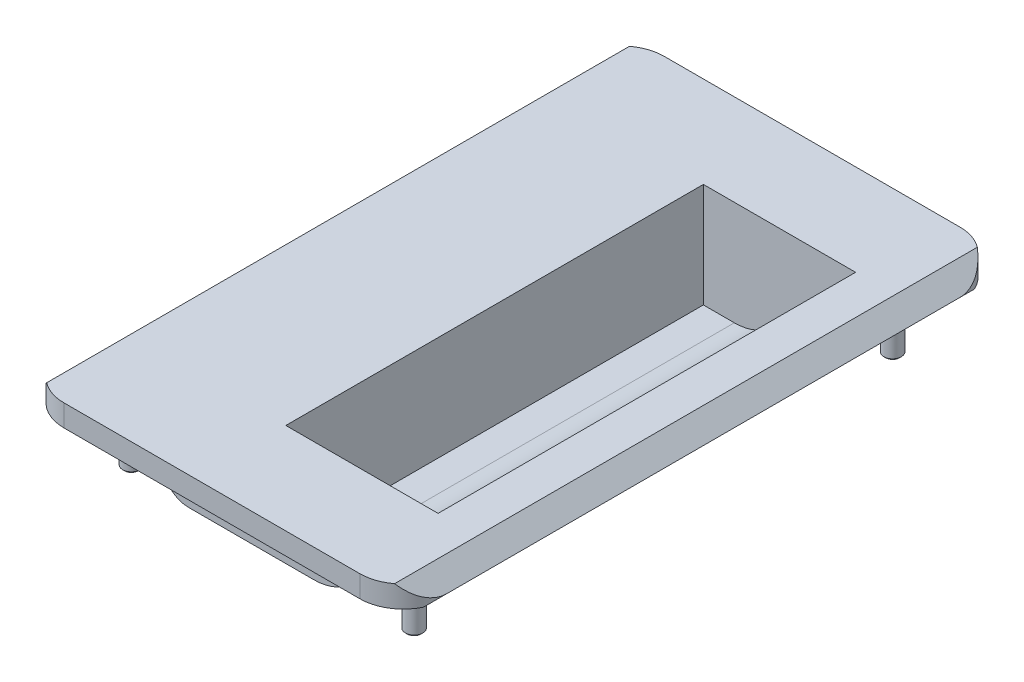
ISO-10303-21;
HEADER;
FILE_DESCRIPTION(('STEP AP214'),'2;1');
FILE_NAME('part.step','',(''),(''),'','','');
FILE_SCHEMA(('AUTOMOTIVE_DESIGN { 1 0 10303 214 1 1 1 1 }'));
ENDSEC;
DATA;
#1=APPLICATION_CONTEXT('core data for automotive mechanical design processes');
#2=APPLICATION_PROTOCOL_DEFINITION('international standard','automotive_design',2000,#1);
#3=PRODUCT_CONTEXT('',#1,'mechanical');
#4=PRODUCT('Part','Part','',(#3));
#5=PRODUCT_RELATED_PRODUCT_CATEGORY('part','',(#4));
#6=PRODUCT_DEFINITION_FORMATION('','',#4);
#7=PRODUCT_DEFINITION_CONTEXT('part definition',#1,'design');
#8=PRODUCT_DEFINITION('design','',#6,#7);
#9=PRODUCT_DEFINITION_SHAPE('','',#8);
#10=(LENGTH_UNIT() NAMED_UNIT(*) SI_UNIT(.MILLI.,.METRE.));
#11=(NAMED_UNIT(*) PLANE_ANGLE_UNIT() SI_UNIT($,.RADIAN.));
#12=(NAMED_UNIT(*) SI_UNIT($,.STERADIAN.) SOLID_ANGLE_UNIT());
#13=UNCERTAINTY_MEASURE_WITH_UNIT(LENGTH_MEASURE(1.E-05),#10,'distance_accuracy_value','');
#14=(GEOMETRIC_REPRESENTATION_CONTEXT(3) GLOBAL_UNCERTAINTY_ASSIGNED_CONTEXT((#13)) GLOBAL_UNIT_ASSIGNED_CONTEXT((#10,
#11,#12)) REPRESENTATION_CONTEXT('',''));
#15=CARTESIAN_POINT('',(0.,0.,0.));
#16=DIRECTION('',(0.,0.,1.));
#17=DIRECTION('',(1.,0.,0.));
#18=AXIS2_PLACEMENT_3D('',#15,#16,#17);
#19=CARTESIAN_POINT('',(34.0705,-14.,-55.));
#20=DIRECTION('',(0.,1.,0.));
#21=DIRECTION('',(0.,0.,1.));
#22=AXIS2_PLACEMENT_3D('',#19,#20,#21);
#23=PLANE('',#22);
#24=CARTESIAN_POINT('',(32.5,-14.00000000001,-55.));
#25=DIRECTION('',(0.,1.,0.));
#26=DIRECTION('',(0.,0.,1.));
#27=AXIS2_PLACEMENT_3D('',#24,#25,#26);
#28=CIRCLE('',#27,1.57050000000709);
#29=CARTESIAN_POINT('',(32.5,-14.00000000001,-53.4294999999929));
#30=VERTEX_POINT('',#29);
#31=EDGE_CURVE('E19',#30,#30,#28,.T.);
#32=ORIENTED_EDGE('',*,*,#31,.F.);
#33=EDGE_LOOP('',(#32));
#34=FACE_BOUND('',#33,.T.);
#35=ADVANCED_FACE('F16',(#34),#23,.F.);
#36=CARTESIAN_POINT('',(-30.9295,-14.,-55.));
#37=DIRECTION('',(0.,1.,0.));
#38=DIRECTION('',(0.,0.,1.));
#39=AXIS2_PLACEMENT_3D('',#36,#37,#38);
#40=PLANE('',#39);
#41=CARTESIAN_POINT('',(-32.5,-14.00000000001,-55.));
#42=DIRECTION('',(0.,1.,0.));
#43=DIRECTION('',(-1.,0.,0.));
#44=AXIS2_PLACEMENT_3D('',#41,#42,#43);
#45=CIRCLE('',#44,1.57050000004119);
#46=CARTESIAN_POINT('',(-34.0705000000412,-14.00000000001,-55.));
#47=VERTEX_POINT('',#46);
#48=EDGE_CURVE('E263',#47,#47,#45,.T.);
#49=ORIENTED_EDGE('',*,*,#48,.F.);
#50=EDGE_LOOP('',(#49));
#51=FACE_BOUND('',#50,.T.);
#52=ADVANCED_FACE('F274',(#51),#40,.F.);
#53=CARTESIAN_POINT('',(34.0705,-14.,55.));
#54=DIRECTION('',(0.,1.,0.));
#55=DIRECTION('',(0.,0.,1.));
#56=AXIS2_PLACEMENT_3D('',#53,#54,#55);
#57=PLANE('',#56);
#58=CARTESIAN_POINT('',(32.5,-14.0000000001237,55.));
#59=DIRECTION('',(0.,1.,0.));
#60=DIRECTION('',(0.,0.,1.));
#61=AXIS2_PLACEMENT_3D('',#58,#59,#60);
#62=CIRCLE('',#61,1.57049999996389);
#63=CARTESIAN_POINT('',(32.5,-14.0000000001237,56.5704999999639));
#64=VERTEX_POINT('',#63);
#65=EDGE_CURVE('E261',#64,#64,#62,.T.);
#66=ORIENTED_EDGE('',*,*,#65,.F.);
#67=EDGE_LOOP('',(#66));
#68=FACE_BOUND('',#67,.T.);
#69=ADVANCED_FACE('F279',(#68),#57,.F.);
#70=CARTESIAN_POINT('',(-30.9295,-14.,55.));
#71=DIRECTION('',(0.,1.,0.));
#72=DIRECTION('',(0.,0.,1.));
#73=AXIS2_PLACEMENT_3D('',#70,#71,#72);
#74=PLANE('',#73);
#75=CARTESIAN_POINT('',(-32.5,-14.0000000001237,55.));
#76=DIRECTION('',(0.,1.,0.));
#77=DIRECTION('',(0.,0.,1.));
#78=AXIS2_PLACEMENT_3D('',#75,#76,#77);
#79=CIRCLE('',#78,1.57049999996389);
#80=CARTESIAN_POINT('',(-32.5,-14.0000000001237,56.5704999999639));
#81=VERTEX_POINT('',#80);
#82=EDGE_CURVE('E257',#81,#81,#79,.T.);
#83=ORIENTED_EDGE('',*,*,#82,.F.);
#84=EDGE_LOOP('',(#83));
#85=FACE_BOUND('',#84,.T.);
#86=ADVANCED_FACE('F409',(#85),#74,.F.);
#87=CARTESIAN_POINT('',(32.5,-13.5705000001281,-55.));
#88=DIRECTION('',(0.,1.,0.));
#89=DIRECTION('',(0.,0.,1.));
#90=AXIS2_PLACEMENT_3D('',#87,#88,#89);
#91=CONICAL_SURFACE('',#90,1.99999999988904,0.78539816339745);
#92=ORIENTED_EDGE('',*,*,#31,.T.);
#93=EDGE_LOOP('',(#92));
#94=FACE_BOUND('',#93,.T.);
#95=CARTESIAN_POINT('',(32.5,-13.5705,-55.));
#96=DIRECTION('',(0.,1.,0.));
#97=DIRECTION('',(0.,0.,1.));
#98=AXIS2_PLACEMENT_3D('',#95,#96,#97);
#99=CIRCLE('',#98,2.);
#100=CARTESIAN_POINT('',(32.5,-13.5705,-53.));
#101=VERTEX_POINT('',#100);
#102=EDGE_CURVE('E427',#101,#101,#99,.T.);
#103=ORIENTED_EDGE('',*,*,#102,.F.);
#104=EDGE_LOOP('',(#103));
#105=FACE_BOUND('',#104,.T.);
#106=ADVANCED_FACE('F270',(#94,#105),#91,.T.);
#107=CARTESIAN_POINT('',(-32.5,-13.5705000000712,-55.));
#108=DIRECTION('',(0.,1.,0.));
#109=DIRECTION('',(-1.,0.,0.));
#110=AXIS2_PLACEMENT_3D('',#107,#108,#109);
#111=CONICAL_SURFACE('',#110,1.99999999997999,0.785398163397448);
#112=CARTESIAN_POINT('',(-32.5,-13.5705,-55.));
#113=DIRECTION('',(0.,1.,0.));
#114=DIRECTION('',(0.,0.,1.));
#115=AXIS2_PLACEMENT_3D('',#112,#113,#114);
#116=CIRCLE('',#115,2.);
#117=CARTESIAN_POINT('',(-32.5,-13.5705,-53.));
#118=VERTEX_POINT('',#117);
#119=EDGE_CURVE('E422',#118,#118,#116,.T.);
#120=ORIENTED_EDGE('',*,*,#119,.F.);
#121=EDGE_LOOP('',(#120));
#122=FACE_BOUND('',#121,.T.);
#123=ORIENTED_EDGE('',*,*,#48,.T.);
#124=EDGE_LOOP('',(#123));
#125=FACE_BOUND('',#124,.T.);
#126=ADVANCED_FACE('F402',(#122,#125),#111,.T.);
#127=CARTESIAN_POINT('',(32.5,-13.570500000128,55.));
#128=DIRECTION('',(0.,1.,0.));
#129=DIRECTION('',(0.,0.,1.));
#130=AXIS2_PLACEMENT_3D('',#127,#128,#129);
#131=CONICAL_SURFACE('',#130,2.00000000001637,0.785398163463622);
#132=ORIENTED_EDGE('',*,*,#65,.T.);
#133=EDGE_LOOP('',(#132));
#134=FACE_BOUND('',#133,.T.);
#135=CARTESIAN_POINT('',(32.5,-13.5705,55.));
#136=DIRECTION('',(0.,1.,0.));
#137=DIRECTION('',(0.,0.,1.));
#138=AXIS2_PLACEMENT_3D('',#135,#136,#137);
#139=CIRCLE('',#138,2.);
#140=CARTESIAN_POINT('',(32.5,-13.5705,57.));
#141=VERTEX_POINT('',#140);
#142=EDGE_CURVE('E421',#141,#141,#139,.T.);
#143=ORIENTED_EDGE('',*,*,#142,.F.);
#144=EDGE_LOOP('',(#143));
#145=FACE_BOUND('',#144,.T.);
#146=ADVANCED_FACE('F398',(#134,#145),#131,.T.);
#147=CARTESIAN_POINT('',(-32.5,-13.5705000000712,55.));
#148=DIRECTION('',(0.,1.,0.));
#149=DIRECTION('',(0.,0.,1.));
#150=AXIS2_PLACEMENT_3D('',#147,#148,#149);
#151=CONICAL_SURFACE('',#150,2.00000000001637,0.785398163397448);
#152=ORIENTED_EDGE('',*,*,#82,.T.);
#153=EDGE_LOOP('',(#152));
#154=FACE_BOUND('',#153,.T.);
#155=CARTESIAN_POINT('',(-32.5,-13.5705,55.));
#156=DIRECTION('',(0.,1.,0.));
#157=DIRECTION('',(0.,0.,1.));
#158=AXIS2_PLACEMENT_3D('',#155,#156,#157);
#159=CIRCLE('',#158,2.);
#160=CARTESIAN_POINT('',(-32.5,-13.5705,57.));
#161=VERTEX_POINT('',#160);
#162=EDGE_CURVE('E256',#161,#161,#159,.T.);
#163=ORIENTED_EDGE('',*,*,#162,.F.);
#164=EDGE_LOOP('',(#163));
#165=FACE_BOUND('',#164,.T.);
#166=ADVANCED_FACE('F394',(#154,#165),#151,.T.);
#167=CARTESIAN_POINT('',(-24.8,-21.,49.5));
#168=DIRECTION('',(0.,1.,0.));
#169=DIRECTION('',(0.,0.,1.));
#170=AXIS2_PLACEMENT_3D('',#167,#168,#169);
#171=PLANE('',#170);
#172=DIRECTION('',(0.,0.,1.));
#173=VECTOR('',#172,1.);
#174=CARTESIAN_POINT('',(-24.8,-21.,49.5));
#175=LINE('',#174,#173);
#176=CARTESIAN_POINT('',(-24.8,-21.,-49.5));
#177=VERTEX_POINT('',#176);
#178=CARTESIAN_POINT('',(-24.8,-21.,49.5));
#179=VERTEX_POINT('',#178);
#180=EDGE_CURVE('E433',#177,#179,#175,.T.);
#181=ORIENTED_EDGE('',*,*,#180,.F.);
#182=DIRECTION('',(1.,0.,0.));
#183=VECTOR('',#182,1.);
#184=CARTESIAN_POINT('',(-24.8,-21.,-49.5));
#185=LINE('',#184,#183);
#186=CARTESIAN_POINT('',(3.91188854031064,-21.,-49.5));
#187=VERTEX_POINT('',#186);
#188=EDGE_CURVE('E254',#177,#187,#185,.T.);
#189=ORIENTED_EDGE('',*,*,#188,.T.);
#190=DIRECTION('',(0.,0.,1.));
#191=VECTOR('',#190,1.);
#192=CARTESIAN_POINT('',(3.91188854177111,-21.,49.5));
#193=LINE('',#192,#191);
#194=CARTESIAN_POINT('',(3.91188854031064,-21.,49.5));
#195=VERTEX_POINT('',#194);
#196=EDGE_CURVE('E260',#195,#187,#193,.F.);
#197=ORIENTED_EDGE('',*,*,#196,.F.);
#198=DIRECTION('',(1.,0.,0.));
#199=VECTOR('',#198,1.);
#200=CARTESIAN_POINT('',(-24.8,-21.,49.5));
#201=LINE('',#200,#199);
#202=EDGE_CURVE('E246',#179,#195,#201,.T.);
#203=ORIENTED_EDGE('',*,*,#202,.F.);
#204=EDGE_LOOP('',(#181,#189,#197,#203));
#205=FACE_BOUND('',#204,.T.);
#206=ADVANCED_FACE('F390',(#205),#171,.F.);
#207=CARTESIAN_POINT('',(3.91188853885016,-8.60000000000004,49.5));
#208=DIRECTION('',(0.,0.,1.));
#209=DIRECTION('',(1.,0.,0.));
#210=AXIS2_PLACEMENT_3D('',#207,#208,#209);
#211=CYLINDRICAL_SURFACE('',#210,12.4);
#212=CARTESIAN_POINT('',(3.91188853885016,-8.60000000000004,49.5));
#213=DIRECTION('',(0.,0.,1.));
#214=DIRECTION('',(1.,0.,0.));
#215=AXIS2_PLACEMENT_3D('',#212,#213,#214);
#216=CIRCLE('',#215,12.4);
#217=CARTESIAN_POINT('',(12.4446687574082,-17.5973141404413,49.5));
#218=VERTEX_POINT('',#217);
#219=EDGE_CURVE('E243',#195,#218,#216,.T.);
#220=ORIENTED_EDGE('',*,*,#219,.F.);
#221=ORIENTED_EDGE('',*,*,#196,.T.);
#222=CARTESIAN_POINT('',(3.91188853885016,-8.60000000000004,-49.5));
#223=DIRECTION('',(0.,0.,1.));
#224=DIRECTION('',(1.,0.,0.));
#225=AXIS2_PLACEMENT_3D('',#222,#223,#224);
#226=CIRCLE('',#225,12.4);
#227=CARTESIAN_POINT('',(12.4446687574082,-17.5973141404413,-49.5));
#228=VERTEX_POINT('',#227);
#229=EDGE_CURVE('E251',#187,#228,#226,.T.);
#230=ORIENTED_EDGE('',*,*,#229,.T.);
#231=DIRECTION('',(0.,0.,1.));
#232=VECTOR('',#231,1.);
#233=CARTESIAN_POINT('',(12.4446687581458,-17.5973141397418,49.5));
#234=LINE('',#233,#232);
#235=EDGE_CURVE('E250',#228,#218,#234,.T.);
#236=ORIENTED_EDGE('',*,*,#235,.T.);
#237=EDGE_LOOP('',(#220,#221,#230,#236));
#238=FACE_BOUND('',#237,.T.);
#239=ADVANCED_FACE('F386',(#238),#211,.T.);
#240=CARTESIAN_POINT('',(-24.8,-14.8,49.5));
#241=DIRECTION('',(0.,0.,1.));
#242=DIRECTION('',(1.,0.,0.));
#243=AXIS2_PLACEMENT_3D('',#240,#241,#242);
#244=CYLINDRICAL_SURFACE('',#243,6.2);
#245=CARTESIAN_POINT('',(-24.8,-14.8,49.5));
#246=DIRECTION('',(0.,0.,1.));
#247=DIRECTION('',(1.,0.,0.));
#248=AXIS2_PLACEMENT_3D('',#245,#246,#247);
#249=CIRCLE('',#248,6.2);
#250=CARTESIAN_POINT('',(-31.,-14.8,49.5));
#251=VERTEX_POINT('',#250);
#252=EDGE_CURVE('E247',#251,#179,#249,.T.);
#253=ORIENTED_EDGE('',*,*,#252,.F.);
#254=DIRECTION('',(0.,0.,-1.));
#255=VECTOR('',#254,1.);
#256=CARTESIAN_POINT('',(-31.,-14.8,49.5));
#257=LINE('',#256,#255);
#258=CARTESIAN_POINT('',(-31.,-14.8,-49.5));
#259=VERTEX_POINT('',#258);
#260=EDGE_CURVE('E521',#251,#259,#257,.T.);
#261=ORIENTED_EDGE('',*,*,#260,.T.);
#262=CARTESIAN_POINT('',(-24.8,-14.8,-49.5));
#263=DIRECTION('',(0.,0.,1.));
#264=DIRECTION('',(1.,0.,0.));
#265=AXIS2_PLACEMENT_3D('',#262,#263,#264);
#266=CIRCLE('',#265,6.2);
#267=EDGE_CURVE('E130',#259,#177,#266,.T.);
#268=ORIENTED_EDGE('',*,*,#267,.T.);
#269=ORIENTED_EDGE('',*,*,#180,.T.);
#270=EDGE_LOOP('',(#253,#261,#268,#269));
#271=FACE_BOUND('',#270,.T.);
#272=ADVANCED_FACE('F382',(#271),#244,.T.);
#273=CARTESIAN_POINT('',(32.5,-14.,-55.));
#274=DIRECTION('',(0.,1.,0.));
#275=DIRECTION('',(0.,0.,1.));
#276=AXIS2_PLACEMENT_3D('',#273,#274,#275);
#277=CYLINDRICAL_SURFACE('',#276,2.);
#278=ORIENTED_EDGE('',*,*,#102,.T.);
#279=EDGE_LOOP('',(#278));
#280=FACE_BOUND('',#279,.T.);
#281=CARTESIAN_POINT('',(32.5,0.,-55.));
#282=DIRECTION('',(0.,1.,0.));
#283=DIRECTION('',(0.,0.,1.));
#284=AXIS2_PLACEMENT_3D('',#281,#282,#283);
#285=CIRCLE('',#284,2.);
#286=CARTESIAN_POINT('',(32.5,0.,-53.));
#287=VERTEX_POINT('',#286);
#288=EDGE_CURVE('E239',#287,#287,#285,.F.);
#289=ORIENTED_EDGE('',*,*,#288,.T.);
#290=EDGE_LOOP('',(#289));
#291=FACE_BOUND('',#290,.T.);
#292=ADVANCED_FACE('F378',(#280,#291),#277,.T.);
#293=CARTESIAN_POINT('',(-32.5,-14.,-55.));
#294=DIRECTION('',(0.,1.,0.));
#295=DIRECTION('',(0.,0.,1.));
#296=AXIS2_PLACEMENT_3D('',#293,#294,#295);
#297=CYLINDRICAL_SURFACE('',#296,2.);
#298=ORIENTED_EDGE('',*,*,#119,.T.);
#299=EDGE_LOOP('',(#298));
#300=FACE_BOUND('',#299,.T.);
#301=CARTESIAN_POINT('',(-32.5,0.,-55.));
#302=DIRECTION('',(0.,1.,0.));
#303=DIRECTION('',(0.,0.,1.));
#304=AXIS2_PLACEMENT_3D('',#301,#302,#303);
#305=CIRCLE('',#304,2.);
#306=CARTESIAN_POINT('',(-32.5,0.,-53.));
#307=VERTEX_POINT('',#306);
#308=EDGE_CURVE('E236',#307,#307,#305,.F.);
#309=ORIENTED_EDGE('',*,*,#308,.T.);
#310=EDGE_LOOP('',(#309));
#311=FACE_BOUND('',#310,.T.);
#312=ADVANCED_FACE('F374',(#300,#311),#297,.T.);
#313=CARTESIAN_POINT('',(32.5,-14.,55.));
#314=DIRECTION('',(0.,1.,0.));
#315=DIRECTION('',(0.,0.,1.));
#316=AXIS2_PLACEMENT_3D('',#313,#314,#315);
#317=CYLINDRICAL_SURFACE('',#316,2.);
#318=ORIENTED_EDGE('',*,*,#142,.T.);
#319=EDGE_LOOP('',(#318));
#320=FACE_BOUND('',#319,.T.);
#321=CARTESIAN_POINT('',(32.5,0.,55.));
#322=DIRECTION('',(0.,1.,0.));
#323=DIRECTION('',(0.,0.,1.));
#324=AXIS2_PLACEMENT_3D('',#321,#322,#323);
#325=CIRCLE('',#324,2.);
#326=CARTESIAN_POINT('',(32.5,0.,57.));
#327=VERTEX_POINT('',#326);
#328=EDGE_CURVE('E233',#327,#327,#325,.F.);
#329=ORIENTED_EDGE('',*,*,#328,.T.);
#330=EDGE_LOOP('',(#329));
#331=FACE_BOUND('',#330,.T.);
#332=ADVANCED_FACE('F370',(#320,#331),#317,.T.);
#333=CARTESIAN_POINT('',(-32.5,-14.,55.));
#334=DIRECTION('',(0.,1.,0.));
#335=DIRECTION('',(0.,0.,1.));
#336=AXIS2_PLACEMENT_3D('',#333,#334,#335);
#337=CYLINDRICAL_SURFACE('',#336,2.);
#338=ORIENTED_EDGE('',*,*,#162,.T.);
#339=EDGE_LOOP('',(#338));
#340=FACE_BOUND('',#339,.T.);
#341=CARTESIAN_POINT('',(-32.5,0.,55.));
#342=DIRECTION('',(0.,1.,0.));
#343=DIRECTION('',(0.,0.,1.));
#344=AXIS2_PLACEMENT_3D('',#341,#342,#343);
#345=CIRCLE('',#344,2.);
#346=CARTESIAN_POINT('',(-32.5,0.,57.));
#347=VERTEX_POINT('',#346);
#348=EDGE_CURVE('E230',#347,#347,#345,.F.);
#349=ORIENTED_EDGE('',*,*,#348,.T.);
#350=EDGE_LOOP('',(#349));
#351=FACE_BOUND('',#350,.T.);
#352=ADVANCED_FACE('F367',(#340,#351),#337,.T.);
#353=CARTESIAN_POINT('',(-24.8,-14.8,-49.5));
#354=DIRECTION('',(0.,0.,1.));
#355=DIRECTION('',(1.,0.,0.));
#356=AXIS2_PLACEMENT_3D('',#353,#354,#355);
#357=PLANE('',#356);
#358=ORIENTED_EDGE('',*,*,#188,.F.);
#359=ORIENTED_EDGE('',*,*,#267,.F.);
#360=DIRECTION('',(0.,1.,0.));
#361=VECTOR('',#360,1.);
#362=CARTESIAN_POINT('',(-31.,0.,-49.5));
#363=LINE('',#362,#361);
#364=CARTESIAN_POINT('',(-31.,0.,-49.5));
#365=VERTEX_POINT('',#364);
#366=EDGE_CURVE('E529',#259,#365,#363,.T.);
#367=ORIENTED_EDGE('',*,*,#366,.T.);
#368=DIRECTION('',(1.,0.,0.));
#369=VECTOR('',#368,1.);
#370=CARTESIAN_POINT('',(31.,0.,-49.5));
#371=LINE('',#370,#369);
#372=CARTESIAN_POINT('',(31.,0.,-49.5));
#373=VERTEX_POINT('',#372);
#374=EDGE_CURVE('E139',#365,#373,#371,.T.);
#375=ORIENTED_EDGE('',*,*,#374,.T.);
#376=DIRECTION('',(-0.725589850092008,-0.688127436920995,0.));
#377=VECTOR('',#376,1.);
#378=CARTESIAN_POINT('',(12.4446687625718,-17.5973141355443,-49.5));
#379=LINE('',#378,#377);
#380=EDGE_CURVE('E253',#373,#228,#379,.T.);
#381=ORIENTED_EDGE('',*,*,#380,.T.);
#382=ORIENTED_EDGE('',*,*,#229,.F.);
#383=EDGE_LOOP('',(#358,#359,#367,#375,#381,#382));
#384=FACE_BOUND('',#383,.T.);
#385=ADVANCED_FACE('F363',(#384),#357,.F.);
#386=CARTESIAN_POINT('',(12.4446687625718,-17.5973141355443,49.5));
#387=DIRECTION('',(-0.688127436920995,0.725589850092008,0.));
#388=DIRECTION('',(-0.725589850092008,-0.688127436920995,0.));
#389=AXIS2_PLACEMENT_3D('',#386,#387,#388);
#390=PLANE('',#389);
#391=ORIENTED_EDGE('',*,*,#235,.F.);
#392=ORIENTED_EDGE('',*,*,#380,.F.);
#393=DIRECTION('',(0.,0.,1.));
#394=VECTOR('',#393,1.);
#395=CARTESIAN_POINT('',(31.,0.,49.5));
#396=LINE('',#395,#394);
#397=CARTESIAN_POINT('',(31.,0.,49.5));
#398=VERTEX_POINT('',#397);
#399=EDGE_CURVE('E541',#373,#398,#396,.T.);
#400=ORIENTED_EDGE('',*,*,#399,.T.);
#401=DIRECTION('',(0.725589850092008,0.688127436920995,0.));
#402=VECTOR('',#401,1.);
#403=CARTESIAN_POINT('',(12.4446687581458,-17.5973141397418,49.5));
#404=LINE('',#403,#402);
#405=EDGE_CURVE('E245',#218,#398,#404,.T.);
#406=ORIENTED_EDGE('',*,*,#405,.F.);
#407=EDGE_LOOP('',(#391,#392,#400,#406));
#408=FACE_BOUND('',#407,.T.);
#409=ADVANCED_FACE('F359',(#408),#390,.F.);
#410=CARTESIAN_POINT('',(-24.8,-14.8,49.5));
#411=DIRECTION('',(0.,0.,1.));
#412=DIRECTION('',(1.,0.,0.));
#413=AXIS2_PLACEMENT_3D('',#410,#411,#412);
#414=PLANE('',#413);
#415=ORIENTED_EDGE('',*,*,#405,.T.);
#416=DIRECTION('',(1.,0.,0.));
#417=VECTOR('',#416,1.);
#418=CARTESIAN_POINT('',(31.,0.,49.5));
#419=LINE('',#418,#417);
#420=CARTESIAN_POINT('',(-31.,0.,49.5));
#421=VERTEX_POINT('',#420);
#422=EDGE_CURVE('E536',#398,#421,#419,.F.);
#423=ORIENTED_EDGE('',*,*,#422,.T.);
#424=DIRECTION('',(0.,1.,0.));
#425=VECTOR('',#424,1.);
#426=CARTESIAN_POINT('',(-31.,0.,49.5));
#427=LINE('',#426,#425);
#428=EDGE_CURVE('E492',#421,#251,#427,.F.);
#429=ORIENTED_EDGE('',*,*,#428,.T.);
#430=ORIENTED_EDGE('',*,*,#252,.T.);
#431=ORIENTED_EDGE('',*,*,#202,.T.);
#432=ORIENTED_EDGE('',*,*,#219,.T.);
#433=EDGE_LOOP('',(#415,#423,#429,#430,#431,#432));
#434=FACE_BOUND('',#433,.T.);
#435=ADVANCED_FACE('F355',(#434),#414,.T.);
#436=CARTESIAN_POINT('',(-31.,0.,49.5));
#437=DIRECTION('',(1.,0.,0.));
#438=DIRECTION('',(0.,0.,-1.));
#439=AXIS2_PLACEMENT_3D('',#436,#437,#438);
#440=PLANE('',#439);
#441=DIRECTION('',(0.,0.,1.));
#442=VECTOR('',#441,1.);
#443=CARTESIAN_POINT('',(-31.,0.,49.5));
#444=LINE('',#443,#442);
#445=EDGE_CURVE('E488',#421,#365,#444,.F.);
#446=ORIENTED_EDGE('',*,*,#445,.T.);
#447=ORIENTED_EDGE('',*,*,#366,.F.);
#448=ORIENTED_EDGE('',*,*,#260,.F.);
#449=ORIENTED_EDGE('',*,*,#428,.F.);
#450=EDGE_LOOP('',(#446,#447,#448,#449));
#451=FACE_BOUND('',#450,.T.);
#452=ADVANCED_FACE('F351',(#451),#440,.F.);
#453=CARTESIAN_POINT('',(3.11388846763829,-6.60000004981879,48.));
#454=DIRECTION('',(0.,0.,1.));
#455=DIRECTION('',(1.,0.,0.));
#456=AXIS2_PLACEMENT_3D('',#453,#454,#455);
#457=CYLINDRICAL_SURFACE('',#456,12.3999999999999);
#458=DIRECTION('',(0.,0.,1.));
#459=VECTOR('',#458,1.);
#460=CARTESIAN_POINT('',(11.646473109972,-15.5974996647902,48.));
#461=LINE('',#460,#459);
#462=CARTESIAN_POINT('',(11.6464731079382,-15.5974996667189,-48.));
#463=VERTEX_POINT('',#462);
#464=CARTESIAN_POINT('',(11.6464731079382,-15.5974996667189,48.));
#465=VERTEX_POINT('',#464);
#466=EDGE_CURVE('E490',#463,#465,#461,.T.);
#467=ORIENTED_EDGE('',*,*,#466,.F.);
#468=CARTESIAN_POINT('',(3.11388846763829,-6.60000004981879,-48.));
#469=DIRECTION('',(0.,0.,1.));
#470=DIRECTION('',(1.,0.,0.));
#471=AXIS2_PLACEMENT_3D('',#468,#469,#470);
#472=CIRCLE('',#471,12.3999999999999);
#473=CARTESIAN_POINT('',(3.115,-19.,-48.));
#474=VERTEX_POINT('',#473);
#475=EDGE_CURVE('E221',#474,#463,#472,.T.);
#476=ORIENTED_EDGE('',*,*,#475,.F.);
#477=DIRECTION('',(0.,0.,1.));
#478=VECTOR('',#477,1.);
#479=CARTESIAN_POINT('',(3.115,-19.,48.));
#480=LINE('',#479,#478);
#481=CARTESIAN_POINT('',(3.115,-19.,48.));
#482=VERTEX_POINT('',#481);
#483=EDGE_CURVE('E242',#482,#474,#480,.F.);
#484=ORIENTED_EDGE('',*,*,#483,.F.);
#485=CARTESIAN_POINT('',(3.11388846763829,-6.60000004981879,48.));
#486=DIRECTION('',(0.,0.,1.));
#487=DIRECTION('',(1.,0.,0.));
#488=AXIS2_PLACEMENT_3D('',#485,#486,#487);
#489=CIRCLE('',#488,12.3999999999999);
#490=EDGE_CURVE('E225',#482,#465,#489,.T.);
#491=ORIENTED_EDGE('',*,*,#490,.T.);
#492=EDGE_LOOP('',(#467,#476,#484,#491));
#493=FACE_BOUND('',#492,.T.);
#494=ADVANCED_FACE('F347',(#493),#457,.F.);
#495=CARTESIAN_POINT('',(11.6464731221746,-15.5974996532181,48.));
#496=DIRECTION('',(-0.688111664376303,0.725604807970065,0.));
#497=DIRECTION('',(-0.725604807970065,-0.688111664376303,0.));
#498=AXIS2_PLACEMENT_3D('',#495,#496,#497);
#499=PLANE('',#498);
#500=DIRECTION('',(0.725604807970064,0.688111664376303,0.));
#501=VECTOR('',#500,1.);
#502=CARTESIAN_POINT('',(11.646473109972,-15.5974996647902,48.));
#503=LINE('',#502,#501);
#504=CARTESIAN_POINT('',(31.,2.756,48.));
#505=VERTEX_POINT('',#504);
#506=EDGE_CURVE('E228',#465,#505,#503,.T.);
#507=ORIENTED_EDGE('',*,*,#506,.T.);
#508=DIRECTION('',(0.,0.,1.));
#509=VECTOR('',#508,1.);
#510=CARTESIAN_POINT('',(31.,2.75599999999999,48.));
#511=LINE('',#510,#509);
#512=CARTESIAN_POINT('',(31.,2.75599999999999,-48.));
#513=VERTEX_POINT('',#512);
#514=EDGE_CURVE('E473',#513,#505,#511,.T.);
#515=ORIENTED_EDGE('',*,*,#514,.F.);
#516=DIRECTION('',(0.725604807970064,0.688111664376303,0.));
#517=VECTOR('',#516,1.);
#518=CARTESIAN_POINT('',(11.646473109972,-15.5974996647902,-48.));
#519=LINE('',#518,#517);
#520=EDGE_CURVE('E223',#463,#513,#519,.T.);
#521=ORIENTED_EDGE('',*,*,#520,.F.);
#522=ORIENTED_EDGE('',*,*,#466,.T.);
#523=EDGE_LOOP('',(#507,#515,#521,#522));
#524=FACE_BOUND('',#523,.T.);
#525=ADVANCED_FACE('F343',(#524),#499,.T.);
#526=CARTESIAN_POINT('',(-4.,-19.,48.));
#527=DIRECTION('',(0.,1.,0.));
#528=DIRECTION('',(-1.,0.,0.));
#529=AXIS2_PLACEMENT_3D('',#526,#527,#528);
#530=PLANE('',#529);
#531=DIRECTION('',(1.,0.,0.));
#532=VECTOR('',#531,1.);
#533=CARTESIAN_POINT('',(3.11388846763829,-19.,48.));
#534=LINE('',#533,#532);
#535=CARTESIAN_POINT('',(-4.,-19.,48.));
#536=VERTEX_POINT('',#535);
#537=EDGE_CURVE('E229',#536,#482,#534,.T.);
#538=ORIENTED_EDGE('',*,*,#537,.T.);
#539=ORIENTED_EDGE('',*,*,#483,.T.);
#540=DIRECTION('',(1.,0.,0.));
#541=VECTOR('',#540,1.);
#542=CARTESIAN_POINT('',(3.11388846763829,-19.,-48.));
#543=LINE('',#542,#541);
#544=CARTESIAN_POINT('',(-4.,-19.,-48.));
#545=VERTEX_POINT('',#544);
#546=EDGE_CURVE('E224',#545,#474,#543,.T.);
#547=ORIENTED_EDGE('',*,*,#546,.F.);
#548=DIRECTION('',(0.,0.,-1.));
#549=VECTOR('',#548,1.);
#550=CARTESIAN_POINT('',(-4.,-19.,48.));
#551=LINE('',#550,#549);
#552=EDGE_CURVE('E220',#536,#545,#551,.T.);
#553=ORIENTED_EDGE('',*,*,#552,.F.);
#554=EDGE_LOOP('',(#538,#539,#547,#553));
#555=FACE_BOUND('',#554,.T.);
#556=ADVANCED_FACE('F339',(#555),#530,.T.);
#557=CARTESIAN_POINT('',(43.,0.,49.5));
#558=DIRECTION('',(-0.70710678118655,0.707106781186545,0.));
#559=DIRECTION('',(-0.707106781186545,-0.70710678118655,0.));
#560=AXIS2_PLACEMENT_3D('',#557,#558,#559);
#561=PLANE('',#560);
#562=CARTESIAN_POINT('',(34.,-9.00000000000008,59.));
#563=DIRECTION('',(-0.70710678118655,0.707106781186545,0.));
#564=DIRECTION('',(0.707106781186545,0.70710678118655,0.));
#565=AXIS2_PLACEMENT_3D('',#562,#563,#564);
#566=ELLIPSE('',#565,14.142135623731,9.99999999999999);
#567=CARTESIAN_POINT('',(43.,0.,63.3588989435407));
#568=VERTEX_POINT('',#567);
#569=CARTESIAN_POINT('',(44.,0.999999999999998,59.));
#570=VERTEX_POINT('',#569);
#571=EDGE_CURVE('E200',#568,#570,#566,.T.);
#572=ORIENTED_EDGE('',*,*,#571,.F.);
#573=DIRECTION('',(0.,0.,1.));
#574=VECTOR('',#573,1.);
#575=CARTESIAN_POINT('',(43.,0.,49.5));
#576=LINE('',#575,#574);
#577=CARTESIAN_POINT('',(43.,0.,-63.3588989435407));
#578=VERTEX_POINT('',#577);
#579=EDGE_CURVE('E483',#568,#578,#576,.F.);
#580=ORIENTED_EDGE('',*,*,#579,.T.);
#581=CARTESIAN_POINT('',(34.,-9.00000000000008,-59.));
#582=DIRECTION('',(-0.70710678118655,0.707106781186545,0.));
#583=DIRECTION('',(0.707106781186545,0.70710678118655,0.));
#584=AXIS2_PLACEMENT_3D('',#581,#582,#583);
#585=ELLIPSE('',#584,14.142135623731,10.);
#586=CARTESIAN_POINT('',(44.,0.999999999999997,-59.));
#587=VERTEX_POINT('',#586);
#588=EDGE_CURVE('E215',#587,#578,#585,.T.);
#589=ORIENTED_EDGE('',*,*,#588,.F.);
#590=DIRECTION('',(0.,0.,1.));
#591=VECTOR('',#590,1.);
#592=CARTESIAN_POINT('',(44.,0.999999999999992,49.5));
#593=LINE('',#592,#591);
#594=EDGE_CURVE('E209',#587,#570,#593,.T.);
#595=ORIENTED_EDGE('',*,*,#594,.T.);
#596=EDGE_LOOP('',(#572,#580,#589,#595));
#597=FACE_BOUND('',#596,.T.);
#598=ADVANCED_FACE('F335',(#597),#561,.F.);
#599=CARTESIAN_POINT('',(31.,0.,49.5));
#600=DIRECTION('',(0.,1.,0.));
#601=DIRECTION('',(0.,0.,1.));
#602=AXIS2_PLACEMENT_3D('',#599,#600,#601);
#603=PLANE('',#602);
#604=CARTESIAN_POINT('',(34.,0.,-59.));
#605=DIRECTION('',(0.,1.,0.));
#606=DIRECTION('',(0.,0.,1.));
#607=AXIS2_PLACEMENT_3D('',#604,#605,#606);
#608=CIRCLE('',#607,10.);
#609=CARTESIAN_POINT('',(34.,0.,-69.));
#610=VERTEX_POINT('',#609);
#611=EDGE_CURVE('E213',#578,#610,#608,.T.);
#612=ORIENTED_EDGE('',*,*,#611,.F.);
#613=ORIENTED_EDGE('',*,*,#579,.F.);
#614=CARTESIAN_POINT('',(34.,0.,59.));
#615=DIRECTION('',(0.,1.,0.));
#616=DIRECTION('',(0.,0.,1.));
#617=AXIS2_PLACEMENT_3D('',#614,#615,#616);
#618=CIRCLE('',#617,9.99999999999999);
#619=CARTESIAN_POINT('',(34.,0.,69.));
#620=VERTEX_POINT('',#619);
#621=EDGE_CURVE('E204',#620,#568,#618,.T.);
#622=ORIENTED_EDGE('',*,*,#621,.F.);
#623=DIRECTION('',(-1.,0.,0.));
#624=VECTOR('',#623,1.);
#625=CARTESIAN_POINT('',(-34.,0.,69.));
#626=LINE('',#625,#624);
#627=CARTESIAN_POINT('',(-34.,0.,69.));
#628=VERTEX_POINT('',#627);
#629=EDGE_CURVE('E199',#620,#628,#626,.T.);
#630=ORIENTED_EDGE('',*,*,#629,.T.);
#631=CARTESIAN_POINT('',(-34.,0.,59.));
#632=DIRECTION('',(0.,1.,0.));
#633=DIRECTION('',(0.,0.,1.));
#634=AXIS2_PLACEMENT_3D('',#631,#632,#633);
#635=CIRCLE('',#634,9.99999999999999);
#636=CARTESIAN_POINT('',(-43.,0.,63.3588989435407));
#637=VERTEX_POINT('',#636);
#638=EDGE_CURVE('E194',#637,#628,#635,.T.);
#639=ORIENTED_EDGE('',*,*,#638,.F.);
#640=DIRECTION('',(0.,0.,1.));
#641=VECTOR('',#640,1.);
#642=CARTESIAN_POINT('',(-43.,0.,49.5));
#643=LINE('',#642,#641);
#644=CARTESIAN_POINT('',(-43.,0.,-63.3588989435406));
#645=VERTEX_POINT('',#644);
#646=EDGE_CURVE('E478',#637,#645,#643,.F.);
#647=ORIENTED_EDGE('',*,*,#646,.T.);
#648=CARTESIAN_POINT('',(-34.,0.,-59.));
#649=DIRECTION('',(0.,1.,0.));
#650=DIRECTION('',(0.,0.,1.));
#651=AXIS2_PLACEMENT_3D('',#648,#649,#650);
#652=CIRCLE('',#651,9.99999999999999);
#653=CARTESIAN_POINT('',(-34.,0.,-69.));
#654=VERTEX_POINT('',#653);
#655=EDGE_CURVE('E218',#654,#645,#652,.T.);
#656=ORIENTED_EDGE('',*,*,#655,.F.);
#657=DIRECTION('',(1.,0.,0.));
#658=VECTOR('',#657,1.);
#659=CARTESIAN_POINT('',(34.,0.,-69.));
#660=LINE('',#659,#658);
#661=EDGE_CURVE('E165',#654,#610,#660,.T.);
#662=ORIENTED_EDGE('',*,*,#661,.T.);
#663=EDGE_LOOP('',(#612,#613,#622,#630,#639,#647,#656,#662));
#664=FACE_BOUND('',#663,.T.);
#665=ORIENTED_EDGE('',*,*,#422,.F.);
#666=ORIENTED_EDGE('',*,*,#399,.F.);
#667=ORIENTED_EDGE('',*,*,#374,.F.);
#668=ORIENTED_EDGE('',*,*,#445,.F.);
#669=EDGE_LOOP('',(#665,#666,#667,#668));
#670=FACE_BOUND('',#669,.T.);
#671=ORIENTED_EDGE('',*,*,#348,.F.);
#672=EDGE_LOOP('',(#671));
#673=FACE_BOUND('',#672,.T.);
#674=ORIENTED_EDGE('',*,*,#328,.F.);
#675=EDGE_LOOP('',(#674));
#676=FACE_BOUND('',#675,.T.);
#677=ORIENTED_EDGE('',*,*,#308,.F.);
#678=EDGE_LOOP('',(#677));
#679=FACE_BOUND('',#678,.T.);
#680=ORIENTED_EDGE('',*,*,#288,.F.);
#681=EDGE_LOOP('',(#680));
#682=FACE_BOUND('',#681,.T.);
#683=ADVANCED_FACE('F331',(#664,#670,#673,#676,#679,#682),#603,.F.);
#684=CARTESIAN_POINT('',(-44.,1.,49.5));
#685=DIRECTION('',(0.70710678118655,0.707106781186545,0.));
#686=DIRECTION('',(-0.707106781186545,0.70710678118655,0.));
#687=AXIS2_PLACEMENT_3D('',#684,#685,#686);
#688=PLANE('',#687);
#689=CARTESIAN_POINT('',(-34.,-9.00000000000008,59.));
#690=DIRECTION('',(0.70710678118655,0.707106781186545,0.));
#691=DIRECTION('',(-0.707106781186545,0.70710678118655,0.));
#692=AXIS2_PLACEMENT_3D('',#689,#690,#691);
#693=ELLIPSE('',#692,14.142135623731,9.99999999999999);
#694=CARTESIAN_POINT('',(-44.,0.999999999999995,59.));
#695=VERTEX_POINT('',#694);
#696=EDGE_CURVE('E196',#695,#637,#693,.T.);
#697=ORIENTED_EDGE('',*,*,#696,.F.);
#698=DIRECTION('',(0.,0.,1.));
#699=VECTOR('',#698,1.);
#700=CARTESIAN_POINT('',(-44.,0.99999999999999,49.5));
#701=LINE('',#700,#699);
#702=CARTESIAN_POINT('',(-44.,0.999999999999995,-59.));
#703=VERTEX_POINT('',#702);
#704=EDGE_CURVE('E191',#695,#703,#701,.F.);
#705=ORIENTED_EDGE('',*,*,#704,.T.);
#706=CARTESIAN_POINT('',(-34.,-9.00000000000008,-59.));
#707=DIRECTION('',(0.70710678118655,0.707106781186545,0.));
#708=DIRECTION('',(-0.707106781186545,0.70710678118655,0.));
#709=AXIS2_PLACEMENT_3D('',#706,#707,#708);
#710=ELLIPSE('',#709,14.142135623731,9.99999999999999);
#711=EDGE_CURVE('E168',#645,#703,#710,.T.);
#712=ORIENTED_EDGE('',*,*,#711,.F.);
#713=ORIENTED_EDGE('',*,*,#646,.F.);
#714=EDGE_LOOP('',(#697,#705,#712,#713));
#715=FACE_BOUND('',#714,.T.);
#716=ADVANCED_FACE('F327',(#715),#688,.F.);
#717=CARTESIAN_POINT('',(3.11388846763829,-6.60000004981879,48.));
#718=DIRECTION('',(0.,0.,1.));
#719=DIRECTION('',(1.,0.,0.));
#720=AXIS2_PLACEMENT_3D('',#717,#718,#719);
#721=PLANE('',#720);
#722=ORIENTED_EDGE('',*,*,#490,.F.);
#723=ORIENTED_EDGE('',*,*,#537,.F.);
#724=DIRECTION('',(0.,1.,0.));
#725=VECTOR('',#724,1.);
#726=CARTESIAN_POINT('',(-4.,5.,48.));
#727=LINE('',#726,#725);
#728=CARTESIAN_POINT('',(-4.,5.,48.));
#729=VERTEX_POINT('',#728);
#730=EDGE_CURVE('E505',#729,#536,#727,.F.);
#731=ORIENTED_EDGE('',*,*,#730,.F.);
#732=DIRECTION('',(1.,0.,0.));
#733=VECTOR('',#732,1.);
#734=CARTESIAN_POINT('',(40.,5.,48.));
#735=LINE('',#734,#733);
#736=CARTESIAN_POINT('',(31.,5.,48.));
#737=VERTEX_POINT('',#736);
#738=EDGE_CURVE('E452',#729,#737,#735,.T.);
#739=ORIENTED_EDGE('',*,*,#738,.T.);
#740=DIRECTION('',(0.,1.,0.));
#741=VECTOR('',#740,1.);
#742=CARTESIAN_POINT('',(31.,2.756,48.));
#743=LINE('',#742,#741);
#744=EDGE_CURVE('E468',#505,#737,#743,.T.);
#745=ORIENTED_EDGE('',*,*,#744,.F.);
#746=ORIENTED_EDGE('',*,*,#506,.F.);
#747=EDGE_LOOP('',(#722,#723,#731,#739,#745,#746));
#748=FACE_BOUND('',#747,.T.);
#749=ADVANCED_FACE('F323',(#748),#721,.F.);
#750=CARTESIAN_POINT('',(31.,2.756,48.));
#751=DIRECTION('',(-1.,0.,0.));
#752=DIRECTION('',(0.,0.,1.));
#753=AXIS2_PLACEMENT_3D('',#750,#751,#752);
#754=PLANE('',#753);
#755=ORIENTED_EDGE('',*,*,#744,.T.);
#756=DIRECTION('',(0.,0.,-1.));
#757=VECTOR('',#756,1.);
#758=CARTESIAN_POINT('',(31.,5.,49.5));
#759=LINE('',#758,#757);
#760=CARTESIAN_POINT('',(31.,5.,-48.));
#761=VERTEX_POINT('',#760);
#762=EDGE_CURVE('E449',#737,#761,#759,.T.);
#763=ORIENTED_EDGE('',*,*,#762,.T.);
#764=DIRECTION('',(0.,1.,0.));
#765=VECTOR('',#764,1.);
#766=CARTESIAN_POINT('',(31.,-6.60000004981879,-48.));
#767=LINE('',#766,#765);
#768=EDGE_CURVE('E463',#513,#761,#767,.T.);
#769=ORIENTED_EDGE('',*,*,#768,.F.);
#770=ORIENTED_EDGE('',*,*,#514,.T.);
#771=EDGE_LOOP('',(#755,#763,#769,#770));
#772=FACE_BOUND('',#771,.T.);
#773=ADVANCED_FACE('F319',(#772),#754,.T.);
#774=CARTESIAN_POINT('',(3.11388846763829,-6.60000004981879,-48.));
#775=DIRECTION('',(0.,0.,1.));
#776=DIRECTION('',(1.,0.,0.));
#777=AXIS2_PLACEMENT_3D('',#774,#775,#776);
#778=PLANE('',#777);
#779=DIRECTION('',(1.,0.,0.));
#780=VECTOR('',#779,1.);
#781=CARTESIAN_POINT('',(40.,5.,-48.));
#782=LINE('',#781,#780);
#783=CARTESIAN_POINT('',(-4.,5.,-48.));
#784=VERTEX_POINT('',#783);
#785=EDGE_CURVE('E185',#761,#784,#782,.F.);
#786=ORIENTED_EDGE('',*,*,#785,.T.);
#787=DIRECTION('',(0.,1.,0.));
#788=VECTOR('',#787,1.);
#789=CARTESIAN_POINT('',(-4.,5.,-48.));
#790=LINE('',#789,#788);
#791=EDGE_CURVE('E499',#545,#784,#790,.T.);
#792=ORIENTED_EDGE('',*,*,#791,.F.);
#793=ORIENTED_EDGE('',*,*,#546,.T.);
#794=ORIENTED_EDGE('',*,*,#475,.T.);
#795=ORIENTED_EDGE('',*,*,#520,.T.);
#796=ORIENTED_EDGE('',*,*,#768,.T.);
#797=EDGE_LOOP('',(#786,#792,#793,#794,#795,#796));
#798=FACE_BOUND('',#797,.T.);
#799=ADVANCED_FACE('F315',(#798),#778,.T.);
#800=CARTESIAN_POINT('',(-4.,5.,48.));
#801=DIRECTION('',(1.,0.,0.));
#802=DIRECTION('',(0.,0.,-1.));
#803=AXIS2_PLACEMENT_3D('',#800,#801,#802);
#804=PLANE('',#803);
#805=ORIENTED_EDGE('',*,*,#730,.T.);
#806=ORIENTED_EDGE('',*,*,#552,.T.);
#807=ORIENTED_EDGE('',*,*,#791,.T.);
#808=DIRECTION('',(0.,0.,-1.));
#809=VECTOR('',#808,1.);
#810=CARTESIAN_POINT('',(-4.,5.,49.5));
#811=LINE('',#810,#809);
#812=EDGE_CURVE('E182',#784,#729,#811,.F.);
#813=ORIENTED_EDGE('',*,*,#812,.T.);
#814=EDGE_LOOP('',(#805,#806,#807,#813));
#815=FACE_BOUND('',#814,.T.);
#816=ADVANCED_FACE('F312',(#815),#804,.T.);
#817=CARTESIAN_POINT('',(-34.,70.,-59.));
#818=DIRECTION('',(0.,1.,0.));
#819=DIRECTION('',(0.,0.,1.));
#820=AXIS2_PLACEMENT_3D('',#817,#818,#819);
#821=CYLINDRICAL_SURFACE('',#820,9.99999999999999);
#822=ORIENTED_EDGE('',*,*,#655,.T.);
#823=ORIENTED_EDGE('',*,*,#711,.T.);
#824=CARTESIAN_POINT('',(-34.,11.,-59.));
#825=DIRECTION('',(0.707106781186548,-0.707106781186547,0.));
#826=DIRECTION('',(0.707106781186547,0.707106781186548,0.));
#827=AXIS2_PLACEMENT_3D('',#824,#825,#826);
#828=ELLIPSE('',#827,14.1421356237309,9.99999999999999);
#829=CARTESIAN_POINT('',(-40.,5.,-67.));
#830=VERTEX_POINT('',#829);
#831=EDGE_CURVE('E181',#703,#830,#828,.T.);
#832=ORIENTED_EDGE('',*,*,#831,.T.);
#833=CARTESIAN_POINT('',(-34.,5.,-59.));
#834=DIRECTION('',(0.,1.,0.));
#835=DIRECTION('',(0.,0.,1.));
#836=AXIS2_PLACEMENT_3D('',#833,#834,#835);
#837=CIRCLE('',#836,9.99999999999999);
#838=CARTESIAN_POINT('',(-34.,5.,-69.));
#839=VERTEX_POINT('',#838);
#840=EDGE_CURVE('E174',#830,#839,#837,.F.);
#841=ORIENTED_EDGE('',*,*,#840,.T.);
#842=DIRECTION('',(0.,1.,0.));
#843=VECTOR('',#842,1.);
#844=CARTESIAN_POINT('',(-34.,70.,-69.));
#845=LINE('',#844,#843);
#846=EDGE_CURVE('E160',#839,#654,#845,.F.);
#847=ORIENTED_EDGE('',*,*,#846,.T.);
#848=EDGE_LOOP('',(#822,#823,#832,#841,#847));
#849=FACE_BOUND('',#848,.T.);
#850=ADVANCED_FACE('F179',(#849),#821,.T.);
#851=CARTESIAN_POINT('',(34.,70.,-69.));
#852=DIRECTION('',(0.,0.,1.));
#853=DIRECTION('',(1.,0.,0.));
#854=AXIS2_PLACEMENT_3D('',#851,#852,#853);
#855=PLANE('',#854);
#856=ORIENTED_EDGE('',*,*,#661,.F.);
#857=ORIENTED_EDGE('',*,*,#846,.F.);
#858=DIRECTION('',(1.,0.,0.));
#859=VECTOR('',#858,1.);
#860=CARTESIAN_POINT('',(40.,5.,-69.));
#861=LINE('',#860,#859);
#862=CARTESIAN_POINT('',(34.,5.,-69.));
#863=VERTEX_POINT('',#862);
#864=EDGE_CURVE('E163',#839,#863,#861,.T.);
#865=ORIENTED_EDGE('',*,*,#864,.T.);
#866=DIRECTION('',(0.,1.,0.));
#867=VECTOR('',#866,1.);
#868=CARTESIAN_POINT('',(34.,70.,-69.));
#869=LINE('',#868,#867);
#870=EDGE_CURVE('E153',#610,#863,#869,.T.);
#871=ORIENTED_EDGE('',*,*,#870,.F.);
#872=EDGE_LOOP('',(#856,#857,#865,#871));
#873=FACE_BOUND('',#872,.T.);
#874=ADVANCED_FACE('F162',(#873),#855,.F.);
#875=CARTESIAN_POINT('',(34.,70.,-59.));
#876=DIRECTION('',(0.,1.,0.));
#877=DIRECTION('',(0.,0.,1.));
#878=AXIS2_PLACEMENT_3D('',#875,#876,#877);
#879=CYLINDRICAL_SURFACE('',#878,10.);
#880=ORIENTED_EDGE('',*,*,#611,.T.);
#881=ORIENTED_EDGE('',*,*,#870,.T.);
#882=CARTESIAN_POINT('',(34.,5.,-59.));
#883=DIRECTION('',(0.,1.,0.));
#884=DIRECTION('',(0.,0.,1.));
#885=AXIS2_PLACEMENT_3D('',#882,#883,#884);
#886=CIRCLE('',#885,10.);
#887=CARTESIAN_POINT('',(40.,5.,-67.));
#888=VERTEX_POINT('',#887);
#889=EDGE_CURVE('E177',#863,#888,#886,.F.);
#890=ORIENTED_EDGE('',*,*,#889,.T.);
#891=CARTESIAN_POINT('',(34.,11.,-59.));
#892=DIRECTION('',(-0.707106781186548,-0.707106781186547,0.));
#893=DIRECTION('',(-0.707106781186547,0.707106781186548,0.));
#894=AXIS2_PLACEMENT_3D('',#891,#892,#893);
#895=ELLIPSE('',#894,14.142135623731,10.);
#896=EDGE_CURVE('E210',#888,#587,#895,.T.);
#897=ORIENTED_EDGE('',*,*,#896,.T.);
#898=ORIENTED_EDGE('',*,*,#588,.T.);
#899=EDGE_LOOP('',(#880,#881,#890,#897,#898));
#900=FACE_BOUND('',#899,.T.);
#901=ADVANCED_FACE('F304',(#900),#879,.T.);
#902=CARTESIAN_POINT('',(44.,1.,49.5));
#903=DIRECTION('',(-0.707106781186548,-0.707106781186547,0.));
#904=DIRECTION('',(0.707106781186547,-0.707106781186548,0.));
#905=AXIS2_PLACEMENT_3D('',#902,#903,#904);
#906=PLANE('',#905);
#907=CARTESIAN_POINT('',(34.,11.,59.));
#908=DIRECTION('',(-0.707106781186548,-0.707106781186547,0.));
#909=DIRECTION('',(-0.707106781186547,0.707106781186548,0.));
#910=AXIS2_PLACEMENT_3D('',#907,#908,#909);
#911=ELLIPSE('',#910,14.142135623731,9.99999999999999);
#912=CARTESIAN_POINT('',(40.,5.,67.));
#913=VERTEX_POINT('',#912);
#914=EDGE_CURVE('E207',#570,#913,#911,.T.);
#915=ORIENTED_EDGE('',*,*,#914,.F.);
#916=ORIENTED_EDGE('',*,*,#594,.F.);
#917=ORIENTED_EDGE('',*,*,#896,.F.);
#918=DIRECTION('',(0.,0.,-1.));
#919=VECTOR('',#918,1.);
#920=CARTESIAN_POINT('',(40.,5.,49.5));
#921=LINE('',#920,#919);
#922=EDGE_CURVE('E438',#888,#913,#921,.F.);
#923=ORIENTED_EDGE('',*,*,#922,.T.);
#924=EDGE_LOOP('',(#915,#916,#917,#923));
#925=FACE_BOUND('',#924,.T.);
#926=ADVANCED_FACE('F300',(#925),#906,.F.);
#927=CARTESIAN_POINT('',(34.,70.,59.));
#928=DIRECTION('',(0.,1.,0.));
#929=DIRECTION('',(0.,0.,1.));
#930=AXIS2_PLACEMENT_3D('',#927,#928,#929);
#931=CYLINDRICAL_SURFACE('',#930,9.99999999999999);
#932=ORIENTED_EDGE('',*,*,#621,.T.);
#933=ORIENTED_EDGE('',*,*,#571,.T.);
#934=ORIENTED_EDGE('',*,*,#914,.T.);
#935=CARTESIAN_POINT('',(34.,5.,59.));
#936=DIRECTION('',(0.,1.,0.));
#937=DIRECTION('',(0.,0.,1.));
#938=AXIS2_PLACEMENT_3D('',#935,#936,#937);
#939=CIRCLE('',#938,9.99999999999999);
#940=CARTESIAN_POINT('',(34.,5.,69.));
#941=VERTEX_POINT('',#940);
#942=EDGE_CURVE('E436',#913,#941,#939,.F.);
#943=ORIENTED_EDGE('',*,*,#942,.T.);
#944=DIRECTION('',(0.,1.,0.));
#945=VECTOR('',#944,1.);
#946=CARTESIAN_POINT('',(34.,70.,69.));
#947=LINE('',#946,#945);
#948=EDGE_CURVE('E203',#941,#620,#947,.F.);
#949=ORIENTED_EDGE('',*,*,#948,.T.);
#950=EDGE_LOOP('',(#932,#933,#934,#943,#949));
#951=FACE_BOUND('',#950,.T.);
#952=ADVANCED_FACE('F296',(#951),#931,.T.);
#953=CARTESIAN_POINT('',(-34.,70.,69.));
#954=DIRECTION('',(0.,0.,-1.));
#955=DIRECTION('',(-1.,0.,0.));
#956=AXIS2_PLACEMENT_3D('',#953,#954,#955);
#957=PLANE('',#956);
#958=ORIENTED_EDGE('',*,*,#629,.F.);
#959=ORIENTED_EDGE('',*,*,#948,.F.);
#960=DIRECTION('',(1.,0.,0.));
#961=VECTOR('',#960,1.);
#962=CARTESIAN_POINT('',(40.,5.,69.));
#963=LINE('',#962,#961);
#964=CARTESIAN_POINT('',(-34.,5.,69.));
#965=VERTEX_POINT('',#964);
#966=EDGE_CURVE('E435',#941,#965,#963,.F.);
#967=ORIENTED_EDGE('',*,*,#966,.T.);
#968=DIRECTION('',(0.,1.,0.));
#969=VECTOR('',#968,1.);
#970=CARTESIAN_POINT('',(-34.,70.,69.));
#971=LINE('',#970,#969);
#972=EDGE_CURVE('E193',#628,#965,#971,.T.);
#973=ORIENTED_EDGE('',*,*,#972,.F.);
#974=EDGE_LOOP('',(#958,#959,#967,#973));
#975=FACE_BOUND('',#974,.T.);
#976=ADVANCED_FACE('F292',(#975),#957,.F.);
#977=CARTESIAN_POINT('',(-34.,70.,59.));
#978=DIRECTION('',(0.,1.,0.));
#979=DIRECTION('',(0.,0.,1.));
#980=AXIS2_PLACEMENT_3D('',#977,#978,#979);
#981=CYLINDRICAL_SURFACE('',#980,9.99999999999999);
#982=ORIENTED_EDGE('',*,*,#638,.T.);
#983=ORIENTED_EDGE('',*,*,#972,.T.);
#984=CARTESIAN_POINT('',(-34.,5.,59.));
#985=DIRECTION('',(0.,1.,0.));
#986=DIRECTION('',(0.,0.,1.));
#987=AXIS2_PLACEMENT_3D('',#984,#985,#986);
#988=CIRCLE('',#987,9.99999999999999);
#989=CARTESIAN_POINT('',(-40.,5.,67.));
#990=VERTEX_POINT('',#989);
#991=EDGE_CURVE('E25',#965,#990,#988,.F.);
#992=ORIENTED_EDGE('',*,*,#991,.T.);
#993=CARTESIAN_POINT('',(-34.,11.,59.));
#994=DIRECTION('',(0.707106781186548,-0.707106781186547,0.));
#995=DIRECTION('',(0.707106781186547,0.707106781186548,0.));
#996=AXIS2_PLACEMENT_3D('',#993,#994,#995);
#997=ELLIPSE('',#996,14.142135623731,9.99999999999999);
#998=EDGE_CURVE('E33',#990,#695,#997,.T.);
#999=ORIENTED_EDGE('',*,*,#998,.T.);
#1000=ORIENTED_EDGE('',*,*,#696,.T.);
#1001=EDGE_LOOP('',(#982,#983,#992,#999,#1000));
#1002=FACE_BOUND('',#1001,.T.);
#1003=ADVANCED_FACE('F287',(#1002),#981,.T.);
#1004=CARTESIAN_POINT('',(-40.,5.,49.5));
#1005=DIRECTION('',(0.707106781186548,-0.707106781186547,0.));
#1006=DIRECTION('',(0.707106781186547,0.707106781186548,0.));
#1007=AXIS2_PLACEMENT_3D('',#1004,#1005,#1006);
#1008=PLANE('',#1007);
#1009=ORIENTED_EDGE('',*,*,#998,.F.);
#1010=DIRECTION('',(0.,0.,-1.));
#1011=VECTOR('',#1010,1.);
#1012=CARTESIAN_POINT('',(-40.,5.,49.5));
#1013=LINE('',#1012,#1011);
#1014=EDGE_CURVE('E11',#990,#830,#1013,.T.);
#1015=ORIENTED_EDGE('',*,*,#1014,.T.);
#1016=ORIENTED_EDGE('',*,*,#831,.F.);
#1017=ORIENTED_EDGE('',*,*,#704,.F.);
#1018=EDGE_LOOP('',(#1009,#1015,#1016,#1017));
#1019=FACE_BOUND('',#1018,.T.);
#1020=ADVANCED_FACE('F282',(#1019),#1008,.F.);
#1021=CARTESIAN_POINT('',(40.,5.,49.5));
#1022=DIRECTION('',(0.,-1.,0.));
#1023=DIRECTION('',(0.,0.,-1.));
#1024=AXIS2_PLACEMENT_3D('',#1021,#1022,#1023);
#1025=PLANE('',#1024);
#1026=ORIENTED_EDGE('',*,*,#991,.F.);
#1027=ORIENTED_EDGE('',*,*,#966,.F.);
#1028=ORIENTED_EDGE('',*,*,#942,.F.);
#1029=ORIENTED_EDGE('',*,*,#922,.F.);
#1030=ORIENTED_EDGE('',*,*,#889,.F.);
#1031=ORIENTED_EDGE('',*,*,#864,.F.);
#1032=ORIENTED_EDGE('',*,*,#840,.F.);
#1033=ORIENTED_EDGE('',*,*,#1014,.F.);
#1034=EDGE_LOOP('',(#1026,#1027,#1028,#1029,#1030,#1031,#1032,#1033));
#1035=FACE_BOUND('',#1034,.T.);
#1036=ORIENTED_EDGE('',*,*,#785,.F.);
#1037=ORIENTED_EDGE('',*,*,#762,.F.);
#1038=ORIENTED_EDGE('',*,*,#738,.F.);
#1039=ORIENTED_EDGE('',*,*,#812,.F.);
#1040=EDGE_LOOP('',(#1036,#1037,#1038,#1039));
#1041=FACE_BOUND('',#1040,.T.);
#1042=ADVANCED_FACE('F172',(#1035,#1041),#1025,.F.);
#1043=CLOSED_SHELL('',(#35,#52,#69,#86,#106,#126,#146,#166,#206,#239,#272,#292,#312,#332,#352,
#385,#409,#435,#452,#494,#525,#556,#598,#683,#716,#749,#773,#799,#816,#850,#874,#901,#926,#952,
#976,#1003,#1020,#1042));
#1044=MANIFOLD_SOLID_BREP('B1',#1043);
#1045=ADVANCED_BREP_SHAPE_REPRESENTATION('',(#18,#1044),#14);
#1046=SHAPE_DEFINITION_REPRESENTATION(#9,#1045);
ENDSEC;
END-ISO-10303-21;
